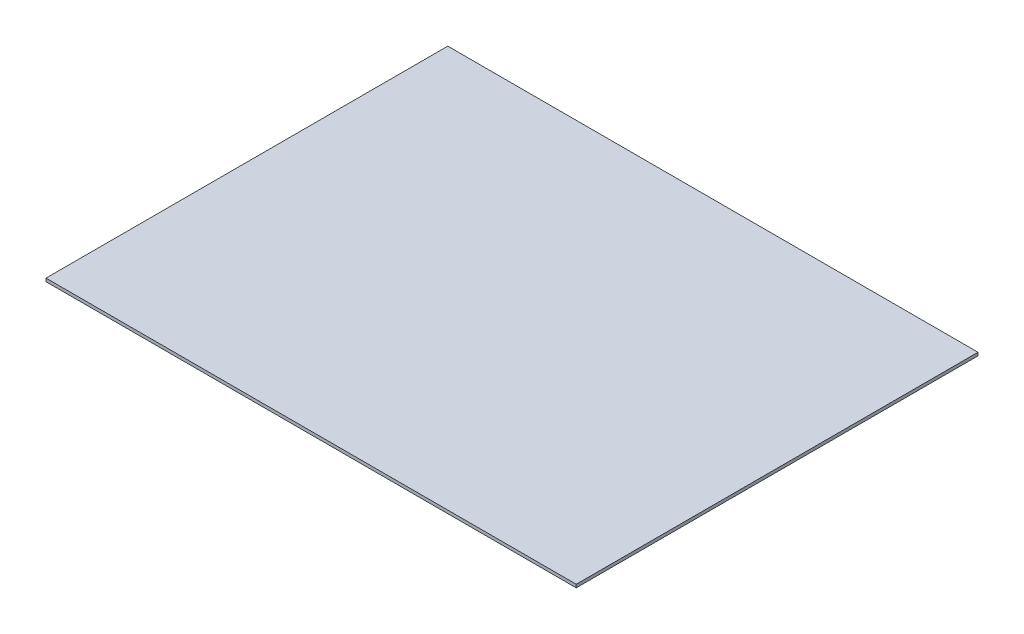
ISO-10303-21;
HEADER;
FILE_DESCRIPTION(('STEP AP214'),'2;1');
FILE_NAME('part.step','',(''),(''),'','','');
FILE_SCHEMA(('AUTOMOTIVE_DESIGN { 1 0 10303 214 1 1 1 1 }'));
ENDSEC;
DATA;
#1=APPLICATION_CONTEXT('core data for automotive mechanical design processes');
#2=APPLICATION_PROTOCOL_DEFINITION('international standard','automotive_design',2000,#1);
#3=PRODUCT_CONTEXT('',#1,'mechanical');
#4=PRODUCT('Part','Part','',(#3));
#5=PRODUCT_RELATED_PRODUCT_CATEGORY('part','',(#4));
#6=PRODUCT_DEFINITION_FORMATION('','',#4);
#7=PRODUCT_DEFINITION_CONTEXT('part definition',#1,'design');
#8=PRODUCT_DEFINITION('design','',#6,#7);
#9=PRODUCT_DEFINITION_SHAPE('','',#8);
#10=(LENGTH_UNIT() NAMED_UNIT(*) SI_UNIT(.MILLI.,.METRE.));
#11=(NAMED_UNIT(*) PLANE_ANGLE_UNIT() SI_UNIT($,.RADIAN.));
#12=(NAMED_UNIT(*) SI_UNIT($,.STERADIAN.) SOLID_ANGLE_UNIT());
#13=UNCERTAINTY_MEASURE_WITH_UNIT(LENGTH_MEASURE(1.E-05),#10,'distance_accuracy_value','');
#14=(GEOMETRIC_REPRESENTATION_CONTEXT(3) GLOBAL_UNCERTAINTY_ASSIGNED_CONTEXT((#13)) GLOBAL_UNIT_ASSIGNED_CONTEXT((#10,
#11,#12)) REPRESENTATION_CONTEXT('',''));
#15=CARTESIAN_POINT('',(0.,0.,0.));
#16=DIRECTION('',(0.,0.,1.));
#17=DIRECTION('',(1.,0.,0.));
#18=AXIS2_PLACEMENT_3D('',#15,#16,#17);
#19=CARTESIAN_POINT('',(268.499999972,3.175,203.454));
#20=DIRECTION('',(-1.,0.,0.));
#21=DIRECTION('',(0.,0.,1.));
#22=AXIS2_PLACEMENT_3D('',#19,#20,#21);
#23=PLANE('',#22);
#24=DIRECTION('',(0.,0.,-1.));
#25=VECTOR('',#24,1.);
#26=CARTESIAN_POINT('',(268.499999972,0.,203.454));
#27=LINE('',#26,#25);
#28=CARTESIAN_POINT('',(268.499999972,0.,203.454));
#29=VERTEX_POINT('',#28);
#30=CARTESIAN_POINT('',(268.499999972,0.,-203.454));
#31=VERTEX_POINT('',#30);
#32=EDGE_CURVE('E102',#29,#31,#27,.T.);
#33=ORIENTED_EDGE('',*,*,#32,.T.);
#34=DIRECTION('',(0.,-1.,0.));
#35=VECTOR('',#34,1.);
#36=CARTESIAN_POINT('',(268.499999972,3.175,-203.454));
#37=LINE('',#36,#35);
#38=CARTESIAN_POINT('',(268.499999972,3.175,-203.454));
#39=VERTEX_POINT('',#38);
#40=EDGE_CURVE('E11',#39,#31,#37,.T.);
#41=ORIENTED_EDGE('',*,*,#40,.F.);
#42=DIRECTION('',(0.,0.,-1.));
#43=VECTOR('',#42,1.);
#44=CARTESIAN_POINT('',(268.499999972,3.175,203.454));
#45=LINE('',#44,#43);
#46=CARTESIAN_POINT('',(268.499999972,3.175,203.454));
#47=VERTEX_POINT('',#46);
#48=EDGE_CURVE('E90',#47,#39,#45,.T.);
#49=ORIENTED_EDGE('',*,*,#48,.F.);
#50=DIRECTION('',(0.,-1.,0.));
#51=VECTOR('',#50,1.);
#52=CARTESIAN_POINT('',(268.499999972,3.175,203.454));
#53=LINE('',#52,#51);
#54=EDGE_CURVE('E98',#47,#29,#53,.T.);
#55=ORIENTED_EDGE('',*,*,#54,.T.);
#56=EDGE_LOOP('',(#33,#41,#49,#55));
#57=FACE_BOUND('',#56,.T.);
#58=ADVANCED_FACE('F39',(#57),#23,.F.);
#59=CARTESIAN_POINT('',(-268.499999972,3.175,-203.454));
#60=DIRECTION('',(0.,0.,1.));
#61=DIRECTION('',(1.,0.,0.));
#62=AXIS2_PLACEMENT_3D('',#59,#60,#61);
#63=PLANE('',#62);
#64=DIRECTION('',(-1.,0.,0.));
#65=VECTOR('',#64,1.);
#66=CARTESIAN_POINT('',(-268.499999972,0.,-203.454));
#67=LINE('',#66,#65);
#68=CARTESIAN_POINT('',(-268.499999972,0.,-203.454));
#69=VERTEX_POINT('',#68);
#70=EDGE_CURVE('E94',#31,#69,#67,.T.);
#71=ORIENTED_EDGE('',*,*,#70,.T.);
#72=DIRECTION('',(0.,-1.,0.));
#73=VECTOR('',#72,1.);
#74=CARTESIAN_POINT('',(-268.499999972,3.175,-203.454));
#75=LINE('',#74,#73);
#76=CARTESIAN_POINT('',(-268.499999972,3.175,-203.454));
#77=VERTEX_POINT('',#76);
#78=EDGE_CURVE('E47',#77,#69,#75,.T.);
#79=ORIENTED_EDGE('',*,*,#78,.F.);
#80=DIRECTION('',(-1.,0.,0.));
#81=VECTOR('',#80,1.);
#82=CARTESIAN_POINT('',(-268.499999972,3.175,-203.454));
#83=LINE('',#82,#81);
#84=EDGE_CURVE('E85',#39,#77,#83,.T.);
#85=ORIENTED_EDGE('',*,*,#84,.F.);
#86=ORIENTED_EDGE('',*,*,#40,.T.);
#87=EDGE_LOOP('',(#71,#79,#85,#86));
#88=FACE_BOUND('',#87,.T.);
#89=ADVANCED_FACE('F93',(#88),#63,.F.);
#90=CARTESIAN_POINT('',(-268.499999972,3.175,203.454));
#91=DIRECTION('',(1.,0.,0.));
#92=DIRECTION('',(0.,0.,-1.));
#93=AXIS2_PLACEMENT_3D('',#90,#91,#92);
#94=PLANE('',#93);
#95=DIRECTION('',(0.,0.,1.));
#96=VECTOR('',#95,1.);
#97=CARTESIAN_POINT('',(-268.499999972,0.,203.454));
#98=LINE('',#97,#96);
#99=CARTESIAN_POINT('',(-268.499999972,0.,203.454));
#100=VERTEX_POINT('',#99);
#101=EDGE_CURVE('E72',#69,#100,#98,.T.);
#102=ORIENTED_EDGE('',*,*,#101,.T.);
#103=DIRECTION('',(0.,-1.,0.));
#104=VECTOR('',#103,1.);
#105=CARTESIAN_POINT('',(-268.499999972,3.175,203.454));
#106=LINE('',#105,#104);
#107=CARTESIAN_POINT('',(-268.499999972,3.175,203.454));
#108=VERTEX_POINT('',#107);
#109=EDGE_CURVE('E95',#108,#100,#106,.T.);
#110=ORIENTED_EDGE('',*,*,#109,.F.);
#111=DIRECTION('',(0.,0.,1.));
#112=VECTOR('',#111,1.);
#113=CARTESIAN_POINT('',(-268.499999972,3.175,203.454));
#114=LINE('',#113,#112);
#115=EDGE_CURVE('E88',#77,#108,#114,.T.);
#116=ORIENTED_EDGE('',*,*,#115,.F.);
#117=ORIENTED_EDGE('',*,*,#78,.T.);
#118=EDGE_LOOP('',(#102,#110,#116,#117));
#119=FACE_BOUND('',#118,.T.);
#120=ADVANCED_FACE('F96',(#119),#94,.F.);
#121=CARTESIAN_POINT('',(-268.499999972,3.175,203.454));
#122=DIRECTION('',(0.,0.,-1.));
#123=DIRECTION('',(-1.,0.,0.));
#124=AXIS2_PLACEMENT_3D('',#121,#122,#123);
#125=PLANE('',#124);
#126=DIRECTION('',(1.,0.,0.));
#127=VECTOR('',#126,1.);
#128=CARTESIAN_POINT('',(-268.499999972,0.,203.454));
#129=LINE('',#128,#127);
#130=EDGE_CURVE('E78',#100,#29,#129,.T.);
#131=ORIENTED_EDGE('',*,*,#130,.T.);
#132=ORIENTED_EDGE('',*,*,#54,.F.);
#133=DIRECTION('',(1.,0.,0.));
#134=VECTOR('',#133,1.);
#135=CARTESIAN_POINT('',(-268.499999972,3.175,203.454));
#136=LINE('',#135,#134);
#137=EDGE_CURVE('E55',#108,#47,#136,.T.);
#138=ORIENTED_EDGE('',*,*,#137,.F.);
#139=ORIENTED_EDGE('',*,*,#109,.T.);
#140=EDGE_LOOP('',(#131,#132,#138,#139));
#141=FACE_BOUND('',#140,.T.);
#142=ADVANCED_FACE('F109',(#141),#125,.F.);
#143=CARTESIAN_POINT('',(0.,3.175,0.));
#144=DIRECTION('',(0.,-1.,0.));
#145=DIRECTION('',(0.,0.,-1.));
#146=AXIS2_PLACEMENT_3D('',#143,#144,#145);
#147=PLANE('',#146);
#148=ORIENTED_EDGE('',*,*,#48,.T.);
#149=ORIENTED_EDGE('',*,*,#84,.T.);
#150=ORIENTED_EDGE('',*,*,#115,.T.);
#151=ORIENTED_EDGE('',*,*,#137,.T.);
#152=EDGE_LOOP('',(#148,#149,#150,#151));
#153=FACE_BOUND('',#152,.T.);
#154=ADVANCED_FACE('F86',(#153),#147,.F.);
#155=CARTESIAN_POINT('',(0.,0.,0.));
#156=DIRECTION('',(0.,-1.,0.));
#157=DIRECTION('',(0.,0.,-1.));
#158=AXIS2_PLACEMENT_3D('',#155,#156,#157);
#159=PLANE('',#158);
#160=ORIENTED_EDGE('',*,*,#32,.F.);
#161=ORIENTED_EDGE('',*,*,#130,.F.);
#162=ORIENTED_EDGE('',*,*,#101,.F.);
#163=ORIENTED_EDGE('',*,*,#70,.F.);
#164=EDGE_LOOP('',(#160,#161,#162,#163));
#165=FACE_BOUND('',#164,.T.);
#166=ADVANCED_FACE('F112',(#165),#159,.T.);
#167=CLOSED_SHELL('',(#58,#89,#120,#142,#154,#166));
#168=MANIFOLD_SOLID_BREP('B2',#167);
#169=ADVANCED_BREP_SHAPE_REPRESENTATION('',(#18,#168),#14);
#170=SHAPE_DEFINITION_REPRESENTATION(#9,#169);
ENDSEC;
END-ISO-10303-21;
